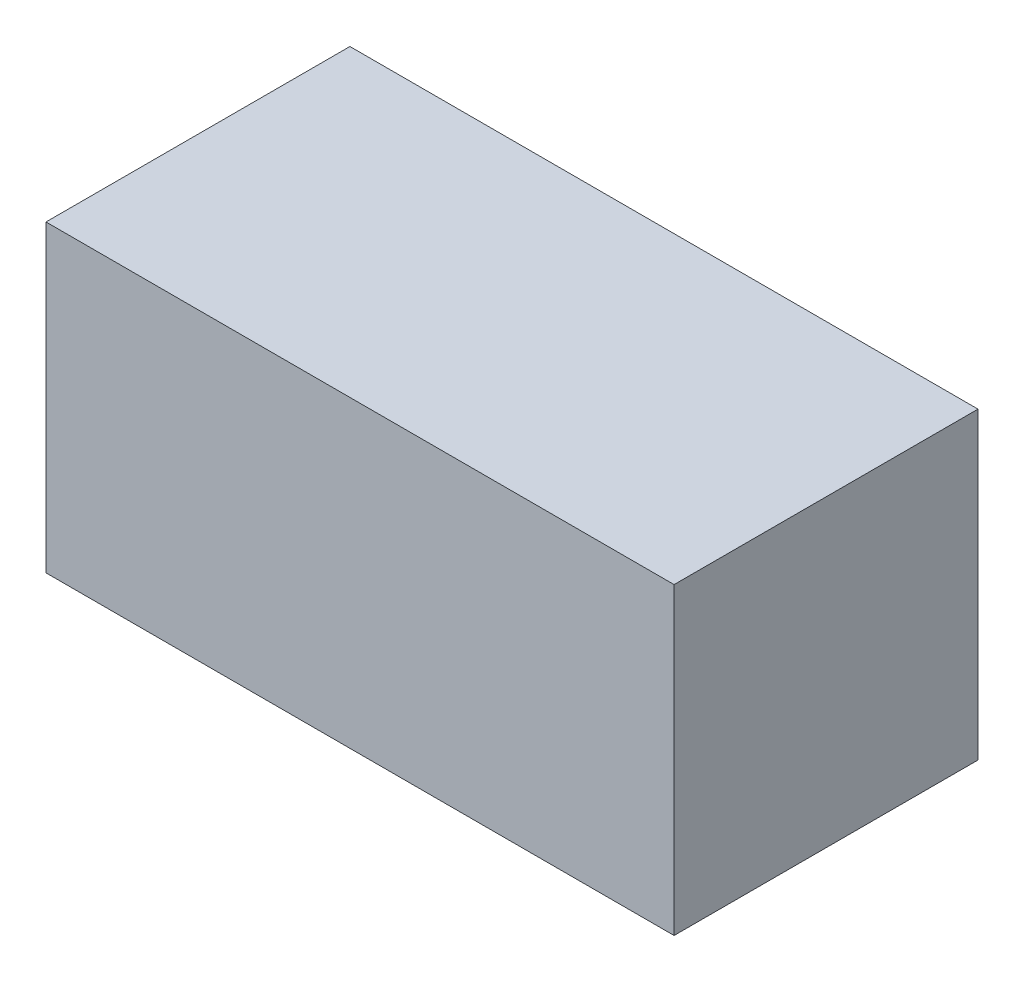
ISO-10303-21;
HEADER;
FILE_DESCRIPTION(('STEP AP214'),'2;1');
FILE_NAME('part.step','',(''),(''),'','','');
FILE_SCHEMA(('AUTOMOTIVE_DESIGN { 1 0 10303 214 1 1 1 1 }'));
ENDSEC;
DATA;
#1=APPLICATION_CONTEXT('core data for automotive mechanical design processes');
#2=APPLICATION_PROTOCOL_DEFINITION('international standard','automotive_design',2000,#1);
#3=PRODUCT_CONTEXT('',#1,'mechanical');
#4=PRODUCT('Part','Part','',(#3));
#5=PRODUCT_RELATED_PRODUCT_CATEGORY('part','',(#4));
#6=PRODUCT_DEFINITION_FORMATION('','',#4);
#7=PRODUCT_DEFINITION_CONTEXT('part definition',#1,'design');
#8=PRODUCT_DEFINITION('design','',#6,#7);
#9=PRODUCT_DEFINITION_SHAPE('','',#8);
#10=(LENGTH_UNIT() NAMED_UNIT(*) SI_UNIT(.MILLI.,.METRE.));
#11=(NAMED_UNIT(*) PLANE_ANGLE_UNIT() SI_UNIT($,.RADIAN.));
#12=(NAMED_UNIT(*) SI_UNIT($,.STERADIAN.) SOLID_ANGLE_UNIT());
#13=UNCERTAINTY_MEASURE_WITH_UNIT(LENGTH_MEASURE(1.E-05),#10,'distance_accuracy_value','');
#14=(GEOMETRIC_REPRESENTATION_CONTEXT(3) GLOBAL_UNCERTAINTY_ASSIGNED_CONTEXT((#13)) GLOBAL_UNIT_ASSIGNED_CONTEXT((#10,
#11,#12)) REPRESENTATION_CONTEXT('',''));
#15=CARTESIAN_POINT('',(0.,0.,0.));
#16=DIRECTION('',(0.,0.,1.));
#17=DIRECTION('',(1.,0.,0.));
#18=AXIS2_PLACEMENT_3D('',#15,#16,#17);
#19=CARTESIAN_POINT('',(0.775,-0.375,0.));
#20=DIRECTION('',(0.,-1.,0.));
#21=DIRECTION('',(0.,0.,-1.));
#22=AXIS2_PLACEMENT_3D('',#19,#20,#21);
#23=PLANE('',#22);
#24=DIRECTION('',(0.,0.,1.));
#25=VECTOR('',#24,1.);
#26=CARTESIAN_POINT('',(-0.775,-0.375,0.));
#27=LINE('',#26,#25);
#28=CARTESIAN_POINT('',(-0.775,-0.375,0.));
#29=VERTEX_POINT('',#28);
#30=CARTESIAN_POINT('',(-0.775,-0.375,0.75));
#31=VERTEX_POINT('',#30);
#32=EDGE_CURVE('E20',#29,#31,#27,.T.);
#33=ORIENTED_EDGE('',*,*,#32,.F.);
#34=DIRECTION('',(1.,0.,0.));
#35=VECTOR('',#34,1.);
#36=CARTESIAN_POINT('',(-0.775,-0.375,0.));
#37=LINE('',#36,#35);
#38=CARTESIAN_POINT('',(0.775,-0.375,0.));
#39=VERTEX_POINT('',#38);
#40=EDGE_CURVE('E80',#29,#39,#37,.T.);
#41=ORIENTED_EDGE('',*,*,#40,.T.);
#42=DIRECTION('',(0.,0.,-1.));
#43=VECTOR('',#42,1.);
#44=CARTESIAN_POINT('',(0.775,-0.375,0.));
#45=LINE('',#44,#43);
#46=CARTESIAN_POINT('',(0.775,-0.375,0.75));
#47=VERTEX_POINT('',#46);
#48=EDGE_CURVE('E68',#47,#39,#45,.T.);
#49=ORIENTED_EDGE('',*,*,#48,.F.);
#50=DIRECTION('',(1.,0.,0.));
#51=VECTOR('',#50,1.);
#52=CARTESIAN_POINT('',(-0.775,-0.375,0.75));
#53=LINE('',#52,#51);
#54=EDGE_CURVE('E56',#31,#47,#53,.T.);
#55=ORIENTED_EDGE('',*,*,#54,.F.);
#56=EDGE_LOOP('',(#33,#41,#49,#55));
#57=FACE_BOUND('',#56,.T.);
#58=ADVANCED_FACE('F17',(#57),#23,.T.);
#59=CARTESIAN_POINT('',(-0.775,-0.375,0.));
#60=DIRECTION('',(-1.,0.,0.));
#61=DIRECTION('',(0.,0.,1.));
#62=AXIS2_PLACEMENT_3D('',#59,#60,#61);
#63=PLANE('',#62);
#64=DIRECTION('',(0.,0.,1.));
#65=VECTOR('',#64,1.);
#66=CARTESIAN_POINT('',(-0.775,0.375,0.));
#67=LINE('',#66,#65);
#68=CARTESIAN_POINT('',(-0.775,0.375,0.));
#69=VERTEX_POINT('',#68);
#70=CARTESIAN_POINT('',(-0.775,0.375,0.75));
#71=VERTEX_POINT('',#70);
#72=EDGE_CURVE('E83',#69,#71,#67,.T.);
#73=ORIENTED_EDGE('',*,*,#72,.F.);
#74=DIRECTION('',(0.,1.,0.));
#75=VECTOR('',#74,1.);
#76=CARTESIAN_POINT('',(-0.775,0.375,0.));
#77=LINE('',#76,#75);
#78=EDGE_CURVE('E65',#69,#29,#77,.F.);
#79=ORIENTED_EDGE('',*,*,#78,.T.);
#80=ORIENTED_EDGE('',*,*,#32,.T.);
#81=DIRECTION('',(0.,1.,0.));
#82=VECTOR('',#81,1.);
#83=CARTESIAN_POINT('',(-0.775,0.375,0.75));
#84=LINE('',#83,#82);
#85=EDGE_CURVE('E62',#71,#31,#84,.F.);
#86=ORIENTED_EDGE('',*,*,#85,.F.);
#87=EDGE_LOOP('',(#73,#79,#80,#86));
#88=FACE_BOUND('',#87,.T.);
#89=ADVANCED_FACE('F61',(#88),#63,.T.);
#90=CARTESIAN_POINT('',(-0.775,0.375,0.75));
#91=DIRECTION('',(0.,0.,1.));
#92=DIRECTION('',(1.,0.,0.));
#93=AXIS2_PLACEMENT_3D('',#90,#91,#92);
#94=PLANE('',#93);
#95=DIRECTION('',(0.,1.,0.));
#96=VECTOR('',#95,1.);
#97=CARTESIAN_POINT('',(0.775,0.375,0.75));
#98=LINE('',#97,#96);
#99=CARTESIAN_POINT('',(0.775,0.375,0.75));
#100=VERTEX_POINT('',#99);
#101=EDGE_CURVE('E70',#100,#47,#98,.F.);
#102=ORIENTED_EDGE('',*,*,#101,.F.);
#103=DIRECTION('',(1.,0.,0.));
#104=VECTOR('',#103,1.);
#105=CARTESIAN_POINT('',(-0.775,0.375,0.75));
#106=LINE('',#105,#104);
#107=EDGE_CURVE('E74',#71,#100,#106,.T.);
#108=ORIENTED_EDGE('',*,*,#107,.F.);
#109=ORIENTED_EDGE('',*,*,#85,.T.);
#110=ORIENTED_EDGE('',*,*,#54,.T.);
#111=EDGE_LOOP('',(#102,#108,#109,#110));
#112=FACE_BOUND('',#111,.T.);
#113=ADVANCED_FACE('F72',(#112),#94,.T.);
#114=CARTESIAN_POINT('',(0.775,0.375,0.));
#115=DIRECTION('',(1.,0.,0.));
#116=DIRECTION('',(0.,0.,-1.));
#117=AXIS2_PLACEMENT_3D('',#114,#115,#116);
#118=PLANE('',#117);
#119=ORIENTED_EDGE('',*,*,#48,.T.);
#120=DIRECTION('',(0.,1.,0.));
#121=VECTOR('',#120,1.);
#122=CARTESIAN_POINT('',(0.775,0.375,0.));
#123=LINE('',#122,#121);
#124=CARTESIAN_POINT('',(0.775,0.375,0.));
#125=VERTEX_POINT('',#124);
#126=EDGE_CURVE('E35',#39,#125,#123,.T.);
#127=ORIENTED_EDGE('',*,*,#126,.T.);
#128=DIRECTION('',(0.,0.,1.));
#129=VECTOR('',#128,1.);
#130=CARTESIAN_POINT('',(0.775,0.375,0.));
#131=LINE('',#130,#129);
#132=EDGE_CURVE('E26',#100,#125,#131,.F.);
#133=ORIENTED_EDGE('',*,*,#132,.F.);
#134=ORIENTED_EDGE('',*,*,#101,.T.);
#135=EDGE_LOOP('',(#119,#127,#133,#134));
#136=FACE_BOUND('',#135,.T.);
#137=ADVANCED_FACE('F89',(#136),#118,.T.);
#138=CARTESIAN_POINT('',(-0.775,0.375,0.));
#139=DIRECTION('',(0.,0.,1.));
#140=DIRECTION('',(1.,0.,0.));
#141=AXIS2_PLACEMENT_3D('',#138,#139,#140);
#142=PLANE('',#141);
#143=ORIENTED_EDGE('',*,*,#126,.F.);
#144=ORIENTED_EDGE('',*,*,#40,.F.);
#145=ORIENTED_EDGE('',*,*,#78,.F.);
#146=DIRECTION('',(1.,0.,0.));
#147=VECTOR('',#146,1.);
#148=CARTESIAN_POINT('',(-0.775,0.375,0.));
#149=LINE('',#148,#147);
#150=EDGE_CURVE('E11',#125,#69,#149,.F.);
#151=ORIENTED_EDGE('',*,*,#150,.F.);
#152=EDGE_LOOP('',(#143,#144,#145,#151));
#153=FACE_BOUND('',#152,.T.);
#154=ADVANCED_FACE('F91',(#153),#142,.F.);
#155=CARTESIAN_POINT('',(-0.775,0.375,0.));
#156=DIRECTION('',(0.,1.,0.));
#157=DIRECTION('',(0.,0.,1.));
#158=AXIS2_PLACEMENT_3D('',#155,#156,#157);
#159=PLANE('',#158);
#160=ORIENTED_EDGE('',*,*,#132,.T.);
#161=ORIENTED_EDGE('',*,*,#150,.T.);
#162=ORIENTED_EDGE('',*,*,#72,.T.);
#163=ORIENTED_EDGE('',*,*,#107,.T.);
#164=EDGE_LOOP('',(#160,#161,#162,#163));
#165=FACE_BOUND('',#164,.T.);
#166=ADVANCED_FACE('F88',(#165),#159,.T.);
#167=CLOSED_SHELL('',(#58,#89,#113,#137,#154,#166));
#168=MANIFOLD_SOLID_BREP('B1',#167);
#169=ADVANCED_BREP_SHAPE_REPRESENTATION('',(#18,#168),#14);
#170=SHAPE_DEFINITION_REPRESENTATION(#9,#169);
ENDSEC;
END-ISO-10303-21;
